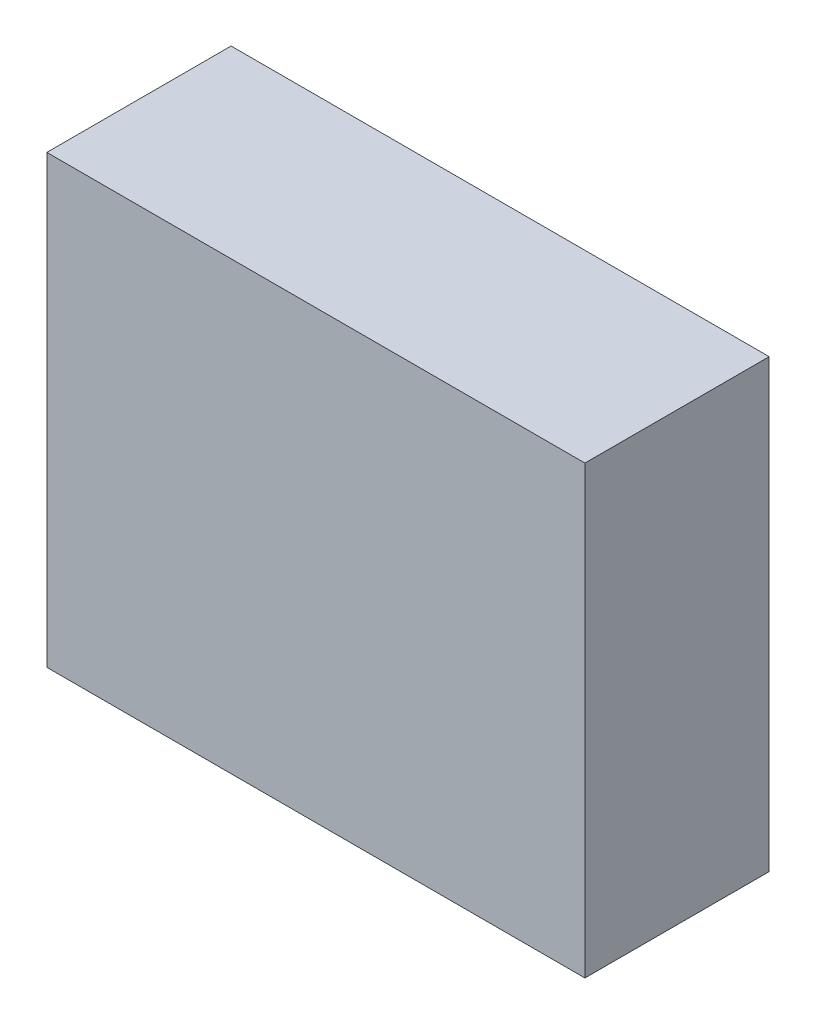
ISO-10303-21;
HEADER;
FILE_DESCRIPTION(('STEP AP214'),'2;1');
FILE_NAME('part.step','',(''),(''),'','','');
FILE_SCHEMA(('AUTOMOTIVE_DESIGN { 1 0 10303 214 1 1 1 1 }'));
ENDSEC;
DATA;
#1=APPLICATION_CONTEXT('core data for automotive mechanical design processes');
#2=APPLICATION_PROTOCOL_DEFINITION('international standard','automotive_design',2000,#1);
#3=PRODUCT_CONTEXT('',#1,'mechanical');
#4=PRODUCT('Part','Part','',(#3));
#5=PRODUCT_RELATED_PRODUCT_CATEGORY('part','',(#4));
#6=PRODUCT_DEFINITION_FORMATION('','',#4);
#7=PRODUCT_DEFINITION_CONTEXT('part definition',#1,'design');
#8=PRODUCT_DEFINITION('design','',#6,#7);
#9=PRODUCT_DEFINITION_SHAPE('','',#8);
#10=(LENGTH_UNIT() NAMED_UNIT(*) SI_UNIT(.MILLI.,.METRE.));
#11=(NAMED_UNIT(*) PLANE_ANGLE_UNIT() SI_UNIT($,.RADIAN.));
#12=(NAMED_UNIT(*) SI_UNIT($,.STERADIAN.) SOLID_ANGLE_UNIT());
#13=UNCERTAINTY_MEASURE_WITH_UNIT(LENGTH_MEASURE(1.E-05),#10,'distance_accuracy_value','');
#14=(GEOMETRIC_REPRESENTATION_CONTEXT(3) GLOBAL_UNCERTAINTY_ASSIGNED_CONTEXT((#13)) GLOBAL_UNIT_ASSIGNED_CONTEXT((#10,
#11,#12)) REPRESENTATION_CONTEXT('',''));
#15=CARTESIAN_POINT('',(0.,0.,0.));
#16=DIRECTION('',(0.,0.,1.));
#17=DIRECTION('',(1.,0.,0.));
#18=AXIS2_PLACEMENT_3D('',#15,#16,#17);
#19=CARTESIAN_POINT('',(-1.46000216,-1.20999504,1.00000054));
#20=DIRECTION('',(0.,0.,-1.));
#21=DIRECTION('',(-1.,0.,0.));
#22=AXIS2_PLACEMENT_3D('',#19,#20,#21);
#23=PLANE('',#22);
#24=DIRECTION('',(0.,1.,0.));
#25=VECTOR('',#24,1.);
#26=CARTESIAN_POINT('',(1.46000216,-1.20999504,1.00000054));
#27=LINE('',#26,#25);
#28=CARTESIAN_POINT('',(1.46000216,-1.20999504,1.00000054));
#29=VERTEX_POINT('',#28);
#30=CARTESIAN_POINT('',(1.46000216,1.20999504,1.00000054));
#31=VERTEX_POINT('',#30);
#32=EDGE_CURVE('E55',#29,#31,#27,.T.);
#33=ORIENTED_EDGE('',*,*,#32,.T.);
#34=DIRECTION('',(1.,0.,0.));
#35=VECTOR('',#34,1.);
#36=CARTESIAN_POINT('',(1.46000216,1.20999504,1.00000054));
#37=LINE('',#36,#35);
#38=CARTESIAN_POINT('',(-1.46000216,1.20999504,1.00000054));
#39=VERTEX_POINT('',#38);
#40=EDGE_CURVE('E57',#31,#39,#37,.F.);
#41=ORIENTED_EDGE('',*,*,#40,.T.);
#42=DIRECTION('',(0.,1.,0.));
#43=VECTOR('',#42,1.);
#44=CARTESIAN_POINT('',(-1.46000216,1.20999504,1.00000054));
#45=LINE('',#44,#43);
#46=CARTESIAN_POINT('',(-1.46000216,-1.20999504,1.00000054));
#47=VERTEX_POINT('',#46);
#48=EDGE_CURVE('E20',#39,#47,#45,.F.);
#49=ORIENTED_EDGE('',*,*,#48,.T.);
#50=DIRECTION('',(1.,0.,0.));
#51=VECTOR('',#50,1.);
#52=CARTESIAN_POINT('',(-1.46000216,-1.20999504,1.00000054));
#53=LINE('',#52,#51);
#54=EDGE_CURVE('E80',#47,#29,#53,.T.);
#55=ORIENTED_EDGE('',*,*,#54,.T.);
#56=EDGE_LOOP('',(#33,#41,#49,#55));
#57=FACE_BOUND('',#56,.T.);
#58=ADVANCED_FACE('F17',(#57),#23,.F.);
#59=CARTESIAN_POINT('',(-1.46000216,1.20999504,0.));
#60=DIRECTION('',(1.,0.,0.));
#61=DIRECTION('',(0.,0.,-1.));
#62=AXIS2_PLACEMENT_3D('',#59,#60,#61);
#63=PLANE('',#62);
#64=DIRECTION('',(0.,0.,1.));
#65=VECTOR('',#64,1.);
#66=CARTESIAN_POINT('',(-1.46000216,-1.20999504,0.));
#67=LINE('',#66,#65);
#68=CARTESIAN_POINT('',(-1.46000216,-1.20999504,0.));
#69=VERTEX_POINT('',#68);
#70=EDGE_CURVE('E68',#69,#47,#67,.T.);
#71=ORIENTED_EDGE('',*,*,#70,.T.);
#72=ORIENTED_EDGE('',*,*,#48,.F.);
#73=DIRECTION('',(0.,0.,-1.));
#74=VECTOR('',#73,1.);
#75=CARTESIAN_POINT('',(-1.46000216,1.20999504,0.));
#76=LINE('',#75,#74);
#77=CARTESIAN_POINT('',(-1.46000216,1.20999504,0.));
#78=VERTEX_POINT('',#77);
#79=EDGE_CURVE('E63',#39,#78,#76,.T.);
#80=ORIENTED_EDGE('',*,*,#79,.T.);
#81=DIRECTION('',(0.,1.,0.));
#82=VECTOR('',#81,1.);
#83=CARTESIAN_POINT('',(-1.46000216,-1.20999504,0.));
#84=LINE('',#83,#82);
#85=EDGE_CURVE('E83',#69,#78,#84,.T.);
#86=ORIENTED_EDGE('',*,*,#85,.F.);
#87=EDGE_LOOP('',(#71,#72,#80,#86));
#88=FACE_BOUND('',#87,.T.);
#89=ADVANCED_FACE('F65',(#88),#63,.F.);
#90=CARTESIAN_POINT('',(1.46000216,1.20999504,0.));
#91=DIRECTION('',(0.,-1.,0.));
#92=DIRECTION('',(0.,0.,-1.));
#93=AXIS2_PLACEMENT_3D('',#90,#91,#92);
#94=PLANE('',#93);
#95=ORIENTED_EDGE('',*,*,#79,.F.);
#96=ORIENTED_EDGE('',*,*,#40,.F.);
#97=DIRECTION('',(0.,0.,1.));
#98=VECTOR('',#97,1.);
#99=CARTESIAN_POINT('',(1.46000216,1.20999504,0.));
#100=LINE('',#99,#98);
#101=CARTESIAN_POINT('',(1.46000216,1.20999504,0.));
#102=VERTEX_POINT('',#101);
#103=EDGE_CURVE('E75',#31,#102,#100,.F.);
#104=ORIENTED_EDGE('',*,*,#103,.T.);
#105=DIRECTION('',(-1.,0.,0.));
#106=VECTOR('',#105,1.);
#107=CARTESIAN_POINT('',(-1.46000216,1.20999504,0.));
#108=LINE('',#107,#106);
#109=EDGE_CURVE('E72',#78,#102,#108,.F.);
#110=ORIENTED_EDGE('',*,*,#109,.F.);
#111=EDGE_LOOP('',(#95,#96,#104,#110));
#112=FACE_BOUND('',#111,.T.);
#113=ADVANCED_FACE('F70',(#112),#94,.F.);
#114=CARTESIAN_POINT('',(1.46000216,-1.20999504,0.));
#115=DIRECTION('',(-1.,0.,0.));
#116=DIRECTION('',(0.,0.,1.));
#117=AXIS2_PLACEMENT_3D('',#114,#115,#116);
#118=PLANE('',#117);
#119=ORIENTED_EDGE('',*,*,#103,.F.);
#120=ORIENTED_EDGE('',*,*,#32,.F.);
#121=DIRECTION('',(0.,0.,1.));
#122=VECTOR('',#121,1.);
#123=CARTESIAN_POINT('',(1.46000216,-1.20999504,0.));
#124=LINE('',#123,#122);
#125=CARTESIAN_POINT('',(1.46000216,-1.20999504,0.));
#126=VERTEX_POINT('',#125);
#127=EDGE_CURVE('E35',#29,#126,#124,.F.);
#128=ORIENTED_EDGE('',*,*,#127,.T.);
#129=DIRECTION('',(0.,1.,0.));
#130=VECTOR('',#129,1.);
#131=CARTESIAN_POINT('',(1.46000216,-1.20999504,0.));
#132=LINE('',#131,#130);
#133=EDGE_CURVE('E26',#102,#126,#132,.F.);
#134=ORIENTED_EDGE('',*,*,#133,.F.);
#135=EDGE_LOOP('',(#119,#120,#128,#134));
#136=FACE_BOUND('',#135,.T.);
#137=ADVANCED_FACE('F89',(#136),#118,.F.);
#138=CARTESIAN_POINT('',(-1.46000216,-1.20999504,0.));
#139=DIRECTION('',(0.,1.,0.));
#140=DIRECTION('',(0.,0.,1.));
#141=AXIS2_PLACEMENT_3D('',#138,#139,#140);
#142=PLANE('',#141);
#143=ORIENTED_EDGE('',*,*,#127,.F.);
#144=ORIENTED_EDGE('',*,*,#54,.F.);
#145=ORIENTED_EDGE('',*,*,#70,.F.);
#146=DIRECTION('',(-1.,0.,0.));
#147=VECTOR('',#146,1.);
#148=CARTESIAN_POINT('',(-1.46000216,-1.20999504,0.));
#149=LINE('',#148,#147);
#150=EDGE_CURVE('E11',#126,#69,#149,.T.);
#151=ORIENTED_EDGE('',*,*,#150,.F.);
#152=EDGE_LOOP('',(#143,#144,#145,#151));
#153=FACE_BOUND('',#152,.T.);
#154=ADVANCED_FACE('F91',(#153),#142,.F.);
#155=CARTESIAN_POINT('',(-1.46000216,-1.20999504,0.));
#156=DIRECTION('',(0.,0.,-1.));
#157=DIRECTION('',(-1.,0.,0.));
#158=AXIS2_PLACEMENT_3D('',#155,#156,#157);
#159=PLANE('',#158);
#160=ORIENTED_EDGE('',*,*,#133,.T.);
#161=ORIENTED_EDGE('',*,*,#150,.T.);
#162=ORIENTED_EDGE('',*,*,#85,.T.);
#163=ORIENTED_EDGE('',*,*,#109,.T.);
#164=EDGE_LOOP('',(#160,#161,#162,#163));
#165=FACE_BOUND('',#164,.T.);
#166=ADVANCED_FACE('F88',(#165),#159,.T.);
#167=CLOSED_SHELL('',(#58,#89,#113,#137,#154,#166));
#168=MANIFOLD_SOLID_BREP('B1',#167);
#169=ADVANCED_BREP_SHAPE_REPRESENTATION('',(#18,#168),#14);
#170=SHAPE_DEFINITION_REPRESENTATION(#9,#169);
ENDSEC;
END-ISO-10303-21;
